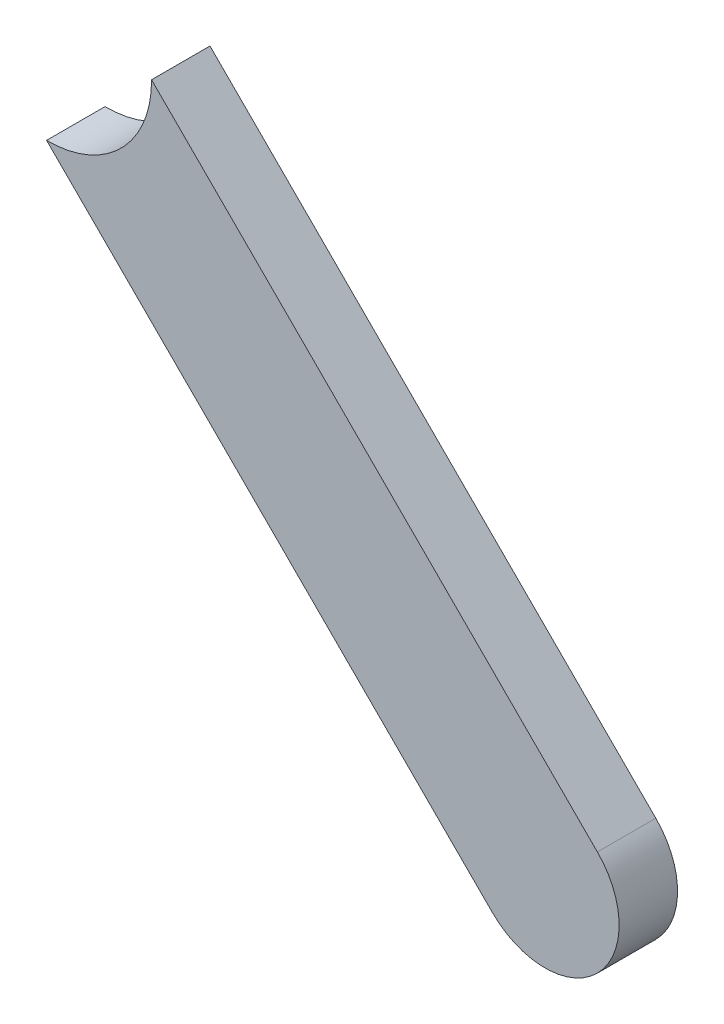
ISO-10303-21;
HEADER;
FILE_DESCRIPTION(('STEP AP214'),'2;1');
FILE_NAME('part.step','',(''),(''),'','','');
FILE_SCHEMA(('AUTOMOTIVE_DESIGN { 1 0 10303 214 1 1 1 1 }'));
ENDSEC;
DATA;
#1=APPLICATION_CONTEXT('core data for automotive mechanical design processes');
#2=APPLICATION_PROTOCOL_DEFINITION('international standard','automotive_design',2000,#1);
#3=PRODUCT_CONTEXT('',#1,'mechanical');
#4=PRODUCT('Part','Part','',(#3));
#5=PRODUCT_RELATED_PRODUCT_CATEGORY('part','',(#4));
#6=PRODUCT_DEFINITION_FORMATION('','',#4);
#7=PRODUCT_DEFINITION_CONTEXT('part definition',#1,'design');
#8=PRODUCT_DEFINITION('design','',#6,#7);
#9=PRODUCT_DEFINITION_SHAPE('','',#8);
#10=(LENGTH_UNIT() NAMED_UNIT(*) SI_UNIT(.MILLI.,.METRE.));
#11=(NAMED_UNIT(*) PLANE_ANGLE_UNIT() SI_UNIT($,.RADIAN.));
#12=(NAMED_UNIT(*) SI_UNIT($,.STERADIAN.) SOLID_ANGLE_UNIT());
#13=UNCERTAINTY_MEASURE_WITH_UNIT(LENGTH_MEASURE(1.E-05),#10,'distance_accuracy_value','');
#14=(GEOMETRIC_REPRESENTATION_CONTEXT(3) GLOBAL_UNCERTAINTY_ASSIGNED_CONTEXT((#13)) GLOBAL_UNIT_ASSIGNED_CONTEXT((#10,
#11,#12)) REPRESENTATION_CONTEXT('',''));
#15=CARTESIAN_POINT('',(0.,0.,0.));
#16=DIRECTION('',(0.,0.,1.));
#17=DIRECTION('',(1.,0.,0.));
#18=AXIS2_PLACEMENT_3D('',#15,#16,#17);
#19=CARTESIAN_POINT('',(121.738572153798,87.8259541062015,0.));
#20=DIRECTION('',(0.707106781186545,0.707106781186551,0.));
#21=DIRECTION('',(0.707106781186551,-0.707106781186545,0.));
#22=AXIS2_PLACEMENT_3D('',#19,#20,#21);
#23=PLANE('',#22);
#24=DIRECTION('',(0.707106781186551,-0.707106781186545,0.));
#25=VECTOR('',#24,1.);
#26=CARTESIAN_POINT('',(121.56259406,88.0019322,0.1999996));
#27=LINE('',#26,#25);
#28=CARTESIAN_POINT('',(121.738572153798,87.8259541062015,0.1999996));
#29=VERTEX_POINT('',#28);
#30=CARTESIAN_POINT('',(123.2643966,86.30012966,0.1999996));
#31=VERTEX_POINT('',#30);
#32=EDGE_CURVE('E11',#29,#31,#27,.T.);
#33=ORIENTED_EDGE('',*,*,#32,.F.);
#34=DIRECTION('',(0.,0.,1.));
#35=VECTOR('',#34,1.);
#36=CARTESIAN_POINT('',(121.738572153798,87.8259541062015,0.));
#37=LINE('',#36,#35);
#38=CARTESIAN_POINT('',(121.738572153798,87.8259541062015,0.));
#39=VERTEX_POINT('',#38);
#40=EDGE_CURVE('E24',#39,#29,#37,.T.);
#41=ORIENTED_EDGE('',*,*,#40,.F.);
#42=DIRECTION('',(0.707106781186551,-0.707106781186545,0.));
#43=VECTOR('',#42,1.);
#44=CARTESIAN_POINT('',(121.56259406,88.0019322,0.));
#45=LINE('',#44,#43);
#46=CARTESIAN_POINT('',(123.2643966,86.30012966,0.));
#47=VERTEX_POINT('',#46);
#48=EDGE_CURVE('E82',#39,#47,#45,.T.);
#49=ORIENTED_EDGE('',*,*,#48,.T.);
#50=DIRECTION('',(0.,0.,1.));
#51=VECTOR('',#50,1.);
#52=CARTESIAN_POINT('',(123.2643966,86.30012966,0.));
#53=LINE('',#52,#51);
#54=EDGE_CURVE('E37',#47,#31,#53,.T.);
#55=ORIENTED_EDGE('',*,*,#54,.T.);
#56=EDGE_LOOP('',(#33,#41,#49,#55));
#57=FACE_BOUND('',#56,.T.);
#58=ADVANCED_FACE('F17',(#57),#23,.F.);
#59=CARTESIAN_POINT('',(123.44400127,86.47973433,0.));
#60=DIRECTION('',(0.,0.,-1.));
#61=DIRECTION('',(-0.707106781186548,-0.707106781186548,0.));
#62=AXIS2_PLACEMENT_3D('',#59,#60,#61);
#63=CYLINDRICAL_SURFACE('',#62,0.253999360179542);
#64=CARTESIAN_POINT('',(123.44400127,86.47973433,0.1999996));
#65=DIRECTION('',(0.,0.,1.));
#66=DIRECTION('',(-0.707106781186548,-0.707106781186548,0.));
#67=AXIS2_PLACEMENT_3D('',#64,#65,#66);
#68=CIRCLE('',#67,0.253999360179542);
#69=CARTESIAN_POINT('',(123.62360594,86.659339,0.1999996));
#70=VERTEX_POINT('',#69);
#71=EDGE_CURVE('E97',#31,#70,#68,.T.);
#72=ORIENTED_EDGE('',*,*,#71,.F.);
#73=ORIENTED_EDGE('',*,*,#54,.F.);
#74=CARTESIAN_POINT('',(123.44400127,86.47973433,0.));
#75=DIRECTION('',(0.,0.,1.));
#76=DIRECTION('',(-0.707106781186548,-0.707106781186548,0.));
#77=AXIS2_PLACEMENT_3D('',#74,#75,#76);
#78=CIRCLE('',#77,0.253999360179542);
#79=CARTESIAN_POINT('',(123.62360594,86.659339,0.));
#80=VERTEX_POINT('',#79);
#81=EDGE_CURVE('E94',#47,#80,#78,.T.);
#82=ORIENTED_EDGE('',*,*,#81,.T.);
#83=DIRECTION('',(0.,0.,1.));
#84=VECTOR('',#83,1.);
#85=CARTESIAN_POINT('',(123.62360594,86.659339,0.));
#86=LINE('',#85,#84);
#87=EDGE_CURVE('E92',#80,#70,#86,.T.);
#88=ORIENTED_EDGE('',*,*,#87,.T.);
#89=EDGE_LOOP('',(#72,#73,#82,#88));
#90=FACE_BOUND('',#89,.T.);
#91=ADVANCED_FACE('F103',(#90),#63,.T.);
#92=CARTESIAN_POINT('',(123.62360594,86.659339,0.));
#93=DIRECTION('',(-0.707106781186548,-0.707106781186548,0.));
#94=DIRECTION('',(-0.707106781186548,0.707106781186548,0.));
#95=AXIS2_PLACEMENT_3D('',#92,#93,#94);
#96=PLANE('',#95);
#97=DIRECTION('',(-0.707106781186548,0.707106781186548,0.));
#98=VECTOR('',#97,1.);
#99=CARTESIAN_POINT('',(123.62360594,86.659339,0.1999996));
#100=LINE('',#99,#98);
#101=CARTESIAN_POINT('',(122.097781493798,88.1851634462016,0.1999996));
#102=VERTEX_POINT('',#101);
#103=EDGE_CURVE('E89',#70,#102,#100,.T.);
#104=ORIENTED_EDGE('',*,*,#103,.F.);
#105=ORIENTED_EDGE('',*,*,#87,.F.);
#106=DIRECTION('',(-0.707106781186548,0.707106781186548,0.));
#107=VECTOR('',#106,1.);
#108=CARTESIAN_POINT('',(123.62360594,86.659339,0.));
#109=LINE('',#108,#107);
#110=CARTESIAN_POINT('',(122.097781493798,88.1851634462016,0.));
#111=VERTEX_POINT('',#110);
#112=EDGE_CURVE('E87',#80,#111,#109,.T.);
#113=ORIENTED_EDGE('',*,*,#112,.T.);
#114=DIRECTION('',(0.,0.,1.));
#115=VECTOR('',#114,1.);
#116=CARTESIAN_POINT('',(122.097781493798,88.1851634462016,0.));
#117=LINE('',#116,#115);
#118=EDGE_CURVE('E69',#111,#102,#117,.T.);
#119=ORIENTED_EDGE('',*,*,#118,.T.);
#120=EDGE_LOOP('',(#104,#105,#113,#119));
#121=FACE_BOUND('',#120,.T.);
#122=ADVANCED_FACE('F108',(#121),#96,.F.);
#123=CARTESIAN_POINT('',(121.7422,88.1815356,0.));
#124=DIRECTION('',(0.,0.,-1.));
#125=DIRECTION('',(1.,0.,0.));
#126=AXIS2_PLACEMENT_3D('',#123,#124,#125);
#127=CYLINDRICAL_SURFACE('',#126,0.3556);
#128=DIRECTION('',(0.,0.,1.));
#129=VECTOR('',#128,1.);
#130=CARTESIAN_POINT('',(122.0978,88.1815356,0.));
#131=LINE('',#130,#129);
#132=CARTESIAN_POINT('',(122.0978,88.1815356,0.));
#133=VERTEX_POINT('',#132);
#134=CARTESIAN_POINT('',(122.0978,88.1815356,0.1999996));
#135=VERTEX_POINT('',#134);
#136=EDGE_CURVE('E59',#133,#135,#131,.T.);
#137=ORIENTED_EDGE('',*,*,#136,.T.);
#138=CARTESIAN_POINT('',(121.7422,88.1815356,0.1999996));
#139=DIRECTION('',(0.,0.,1.));
#140=DIRECTION('',(1.,0.,0.));
#141=AXIS2_PLACEMENT_3D('',#138,#139,#140);
#142=CIRCLE('',#141,0.3556);
#143=EDGE_CURVE('E70',#135,#102,#142,.T.);
#144=ORIENTED_EDGE('',*,*,#143,.T.);
#145=ORIENTED_EDGE('',*,*,#118,.F.);
#146=CARTESIAN_POINT('',(121.7422,88.1815356,0.));
#147=DIRECTION('',(0.,0.,1.));
#148=DIRECTION('',(1.,0.,0.));
#149=AXIS2_PLACEMENT_3D('',#146,#147,#148);
#150=CIRCLE('',#149,0.3556);
#151=EDGE_CURVE('E73',#133,#111,#150,.T.);
#152=ORIENTED_EDGE('',*,*,#151,.F.);
#153=EDGE_LOOP('',(#137,#144,#145,#152));
#154=FACE_BOUND('',#153,.T.);
#155=ADVANCED_FACE('F74',(#154),#127,.F.);
#156=CARTESIAN_POINT('',(121.7422,88.1815356,0.));
#157=DIRECTION('',(0.,0.,-1.));
#158=DIRECTION('',(1.,0.,0.));
#159=AXIS2_PLACEMENT_3D('',#156,#157,#158);
#160=CYLINDRICAL_SURFACE('',#159,0.3556);
#161=ORIENTED_EDGE('',*,*,#40,.T.);
#162=CARTESIAN_POINT('',(121.7422,88.1815356,0.1999996));
#163=DIRECTION('',(0.,0.,1.));
#164=DIRECTION('',(1.,0.,0.));
#165=AXIS2_PLACEMENT_3D('',#162,#163,#164);
#166=CIRCLE('',#165,0.3556);
#167=EDGE_CURVE('E65',#29,#135,#166,.T.);
#168=ORIENTED_EDGE('',*,*,#167,.T.);
#169=ORIENTED_EDGE('',*,*,#136,.F.);
#170=EDGE_CURVE('E63',#39,#133,#150,.T.);
#171=ORIENTED_EDGE('',*,*,#170,.F.);
#172=EDGE_LOOP('',(#161,#168,#169,#171));
#173=FACE_BOUND('',#172,.T.);
#174=ADVANCED_FACE('F61',(#173),#160,.F.);
#175=CARTESIAN_POINT('',(121.56259406,88.0019322,0.));
#176=DIRECTION('',(0.,0.,-1.));
#177=DIRECTION('',(-1.,0.,0.));
#178=AXIS2_PLACEMENT_3D('',#175,#176,#177);
#179=PLANE('',#178);
#180=ORIENTED_EDGE('',*,*,#48,.F.);
#181=ORIENTED_EDGE('',*,*,#170,.T.);
#182=ORIENTED_EDGE('',*,*,#151,.T.);
#183=ORIENTED_EDGE('',*,*,#112,.F.);
#184=ORIENTED_EDGE('',*,*,#81,.F.);
#185=EDGE_LOOP('',(#180,#181,#182,#183,#184));
#186=FACE_BOUND('',#185,.T.);
#187=ADVANCED_FACE('F80',(#186),#179,.T.);
#188=CARTESIAN_POINT('',(121.56259406,88.0019322,0.1999996));
#189=DIRECTION('',(0.,0.,-1.));
#190=DIRECTION('',(-1.,0.,0.));
#191=AXIS2_PLACEMENT_3D('',#188,#189,#190);
#192=PLANE('',#191);
#193=ORIENTED_EDGE('',*,*,#167,.F.);
#194=ORIENTED_EDGE('',*,*,#32,.T.);
#195=ORIENTED_EDGE('',*,*,#71,.T.);
#196=ORIENTED_EDGE('',*,*,#103,.T.);
#197=ORIENTED_EDGE('',*,*,#143,.F.);
#198=EDGE_LOOP('',(#193,#194,#195,#196,#197));
#199=FACE_BOUND('',#198,.T.);
#200=ADVANCED_FACE('F106',(#199),#192,.F.);
#201=CLOSED_SHELL('',(#58,#91,#122,#155,#174,#187,#200));
#202=MANIFOLD_SOLID_BREP('B1',#201);
#203=ADVANCED_BREP_SHAPE_REPRESENTATION('',(#18,#202),#14);
#204=SHAPE_DEFINITION_REPRESENTATION(#9,#203);
ENDSEC;
END-ISO-10303-21;
